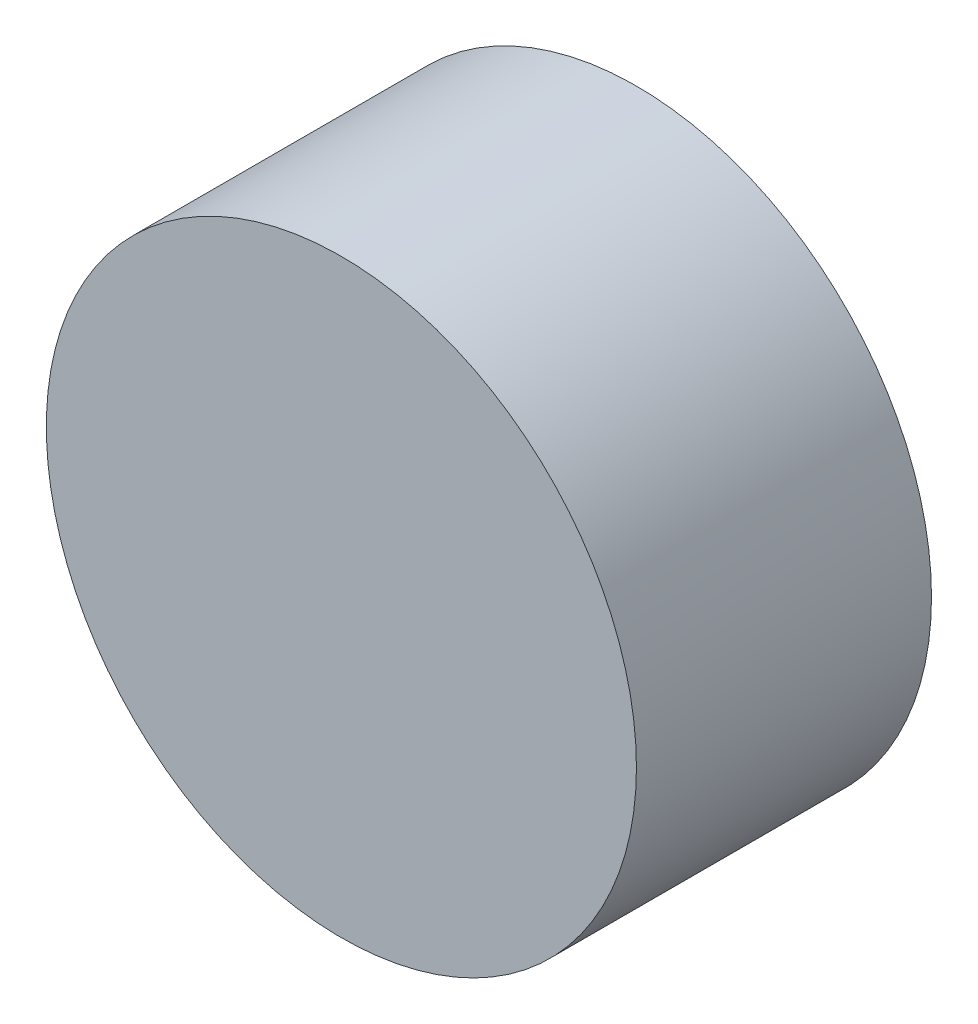
ISO-10303-21;
HEADER;
FILE_DESCRIPTION(('STEP AP214'),'2;1');
FILE_NAME('part.step','',(''),(''),'','','');
FILE_SCHEMA(('AUTOMOTIVE_DESIGN { 1 0 10303 214 1 1 1 1 }'));
ENDSEC;
DATA;
#1=APPLICATION_CONTEXT('core data for automotive mechanical design processes');
#2=APPLICATION_PROTOCOL_DEFINITION('international standard','automotive_design',2000,#1);
#3=PRODUCT_CONTEXT('',#1,'mechanical');
#4=PRODUCT('Part','Part','',(#3));
#5=PRODUCT_RELATED_PRODUCT_CATEGORY('part','',(#4));
#6=PRODUCT_DEFINITION_FORMATION('','',#4);
#7=PRODUCT_DEFINITION_CONTEXT('part definition',#1,'design');
#8=PRODUCT_DEFINITION('design','',#6,#7);
#9=PRODUCT_DEFINITION_SHAPE('','',#8);
#10=(LENGTH_UNIT() NAMED_UNIT(*) SI_UNIT(.MILLI.,.METRE.));
#11=(NAMED_UNIT(*) PLANE_ANGLE_UNIT() SI_UNIT($,.RADIAN.));
#12=(NAMED_UNIT(*) SI_UNIT($,.STERADIAN.) SOLID_ANGLE_UNIT());
#13=UNCERTAINTY_MEASURE_WITH_UNIT(LENGTH_MEASURE(1.E-05),#10,'distance_accuracy_value','');
#14=(GEOMETRIC_REPRESENTATION_CONTEXT(3) GLOBAL_UNCERTAINTY_ASSIGNED_CONTEXT((#13)) GLOBAL_UNIT_ASSIGNED_CONTEXT((#10,
#11,#12)) REPRESENTATION_CONTEXT('',''));
#15=CARTESIAN_POINT('',(0.,0.,0.));
#16=DIRECTION('',(0.,0.,1.));
#17=DIRECTION('',(1.,0.,0.));
#18=AXIS2_PLACEMENT_3D('',#15,#16,#17);
#19=CARTESIAN_POINT('',(0.,0.,2.5));
#20=DIRECTION('',(0.,0.,-1.));
#21=DIRECTION('',(-1.,0.,0.));
#22=AXIS2_PLACEMENT_3D('',#19,#20,#21);
#23=CYLINDRICAL_SURFACE('',#22,2.5);
#24=CARTESIAN_POINT('',(0.,0.,2.5));
#25=DIRECTION('',(0.,0.,1.));
#26=DIRECTION('',(1.,0.,0.));
#27=AXIS2_PLACEMENT_3D('',#24,#25,#26);
#28=CIRCLE('',#27,2.5);
#29=CARTESIAN_POINT('',(2.5,0.,2.5));
#30=VERTEX_POINT('',#29);
#31=EDGE_CURVE('E10',#30,#30,#28,.T.);
#32=ORIENTED_EDGE('',*,*,#31,.F.);
#33=EDGE_LOOP('',(#32));
#34=FACE_BOUND('',#33,.T.);
#35=CARTESIAN_POINT('',(0.,0.,0.));
#36=DIRECTION('',(0.,0.,1.));
#37=DIRECTION('',(1.,0.,0.));
#38=AXIS2_PLACEMENT_3D('',#35,#36,#37);
#39=CIRCLE('',#38,2.5);
#40=CARTESIAN_POINT('',(2.5,0.,0.));
#41=VERTEX_POINT('',#40);
#42=EDGE_CURVE('E40',#41,#41,#39,.T.);
#43=ORIENTED_EDGE('',*,*,#42,.T.);
#44=EDGE_LOOP('',(#43));
#45=FACE_BOUND('',#44,.T.);
#46=ADVANCED_FACE('F37',(#34,#45),#23,.T.);
#47=CARTESIAN_POINT('',(0.,0.,2.5));
#48=DIRECTION('',(0.,0.,1.));
#49=DIRECTION('',(1.,0.,0.));
#50=AXIS2_PLACEMENT_3D('',#47,#48,#49);
#51=PLANE('',#50);
#52=ORIENTED_EDGE('',*,*,#31,.T.);
#53=EDGE_LOOP('',(#52));
#54=FACE_BOUND('',#53,.T.);
#55=ADVANCED_FACE('F54',(#54),#51,.T.);
#56=CARTESIAN_POINT('',(0.,0.,0.));
#57=DIRECTION('',(0.,0.,1.));
#58=DIRECTION('',(1.,0.,0.));
#59=AXIS2_PLACEMENT_3D('',#56,#57,#58);
#60=PLANE('',#59);
#61=ORIENTED_EDGE('',*,*,#42,.F.);
#62=EDGE_LOOP('',(#61));
#63=FACE_BOUND('',#62,.T.);
#64=ADVANCED_FACE('F52',(#63),#60,.F.);
#65=CLOSED_SHELL('',(#46,#55,#64));
#66=MANIFOLD_SOLID_BREP('B2',#65);
#67=ADVANCED_BREP_SHAPE_REPRESENTATION('',(#18,#66),#14);
#68=SHAPE_DEFINITION_REPRESENTATION(#9,#67);
ENDSEC;
END-ISO-10303-21;
